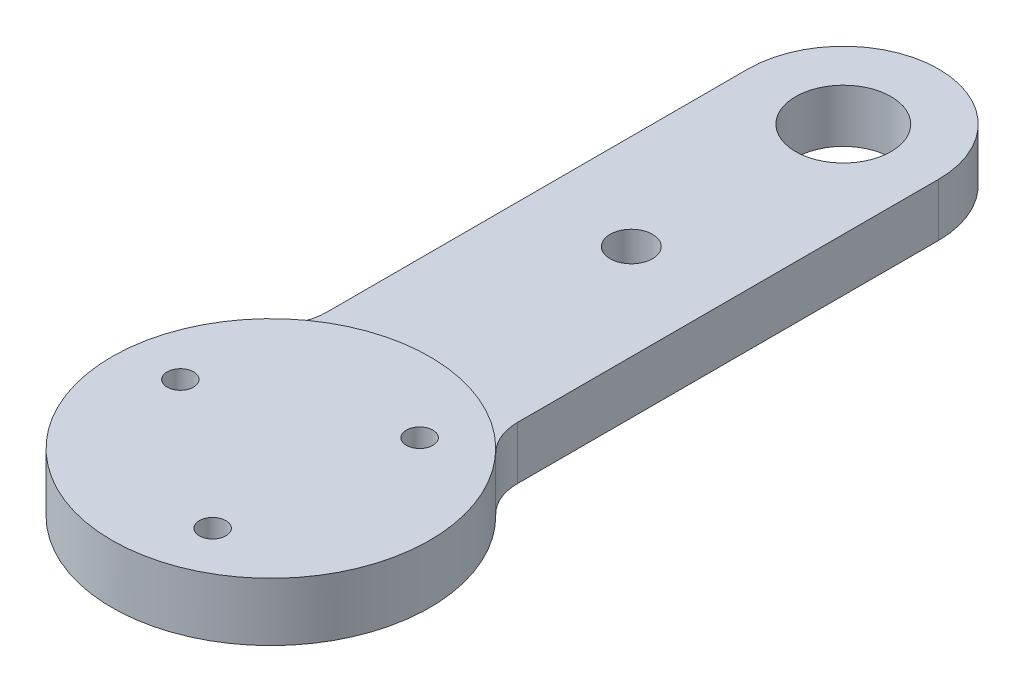
ISO-10303-21;
HEADER;
FILE_DESCRIPTION(('STEP AP214'),'2;1');
FILE_NAME('part.step','',(''),(''),'','','');
FILE_SCHEMA(('AUTOMOTIVE_DESIGN { 1 0 10303 214 1 1 1 1 }'));
ENDSEC;
DATA;
#1=APPLICATION_CONTEXT('core data for automotive mechanical design processes');
#2=APPLICATION_PROTOCOL_DEFINITION('international standard','automotive_design',2000,#1);
#3=PRODUCT_CONTEXT('',#1,'mechanical');
#4=PRODUCT('Part','Part','',(#3));
#5=PRODUCT_RELATED_PRODUCT_CATEGORY('part','',(#4));
#6=PRODUCT_DEFINITION_FORMATION('','',#4);
#7=PRODUCT_DEFINITION_CONTEXT('part definition',#1,'design');
#8=PRODUCT_DEFINITION('design','',#6,#7);
#9=PRODUCT_DEFINITION_SHAPE('','',#8);
#10=(LENGTH_UNIT() NAMED_UNIT(*) SI_UNIT(.MILLI.,.METRE.));
#11=(NAMED_UNIT(*) PLANE_ANGLE_UNIT() SI_UNIT($,.RADIAN.));
#12=(NAMED_UNIT(*) SI_UNIT($,.STERADIAN.) SOLID_ANGLE_UNIT());
#13=UNCERTAINTY_MEASURE_WITH_UNIT(LENGTH_MEASURE(1.E-05),#10,'distance_accuracy_value','');
#14=(GEOMETRIC_REPRESENTATION_CONTEXT(3) GLOBAL_UNCERTAINTY_ASSIGNED_CONTEXT((#13)) GLOBAL_UNIT_ASSIGNED_CONTEXT((#10,
#11,#12)) REPRESENTATION_CONTEXT('',''));
#15=CARTESIAN_POINT('',(0.,0.,0.));
#16=DIRECTION('',(0.,0.,1.));
#17=DIRECTION('',(1.,0.,0.));
#18=AXIS2_PLACEMENT_3D('',#15,#16,#17);
#19=CARTESIAN_POINT('',(-5.86046511627907,5.,-23.546511627907));
#20=DIRECTION('',(0.,-1.,0.));
#21=DIRECTION('',(0.,0.,-1.));
#22=AXIS2_PLACEMENT_3D('',#19,#20,#21);
#23=PLANE('',#22);
#24=CARTESIAN_POINT('',(-5.86046511627907,5.,-3.54651162790698));
#25=DIRECTION('',(0.,1.,0.));
#26=DIRECTION('',(0.,0.,1.));
#27=AXIS2_PLACEMENT_3D('',#24,#25,#26);
#28=CIRCLE('',#27,2.);
#29=CARTESIAN_POINT('',(-5.86046511627907,5.,-1.54651162790697));
#30=VERTEX_POINT('',#29);
#31=EDGE_CURVE('E127',#30,#30,#28,.T.);
#32=ORIENTED_EDGE('',*,*,#31,.F.);
#33=EDGE_LOOP('',(#32));
#34=FACE_BOUND('',#33,.T.);
#35=CARTESIAN_POINT('',(-5.86046511627907,5.,-23.546511627907));
#36=DIRECTION('',(0.,1.,0.));
#37=DIRECTION('',(0.,0.,1.));
#38=AXIS2_PLACEMENT_3D('',#35,#36,#37);
#39=CIRCLE('',#38,4.5);
#40=CARTESIAN_POINT('',(-5.86046511627907,5.,-19.046511627907));
#41=VERTEX_POINT('',#40);
#42=EDGE_CURVE('E136',#41,#41,#39,.T.);
#43=ORIENTED_EDGE('',*,*,#42,.F.);
#44=EDGE_LOOP('',(#43));
#45=FACE_BOUND('',#44,.T.);
#46=CARTESIAN_POINT('',(-5.86046511627907,5.,30.453488372093));
#47=DIRECTION('',(0.,1.,0.));
#48=DIRECTION('',(0.,0.,1.));
#49=AXIS2_PLACEMENT_3D('',#46,#47,#48);
#50=CIRCLE('',#49,15.);
#51=CARTESIAN_POINT('',(4.63953488372093,5.,19.7413457292787));
#52=VERTEX_POINT('',#51);
#53=CARTESIAN_POINT('',(-16.3604651162791,5.,19.7413457292787));
#54=VERTEX_POINT('',#53);
#55=EDGE_CURVE('E111',#52,#54,#50,.T.);
#56=ORIENTED_EDGE('',*,*,#55,.F.);
#57=CARTESIAN_POINT('',(8.13953488372107,5.,16.1706315150073));
#58=DIRECTION('',(0.,-1.,0.));
#59=DIRECTION('',(0.,0.,1.));
#60=AXIS2_PLACEMENT_3D('',#57,#58,#59);
#61=CIRCLE('',#60,5.00000000000013);
#62=CARTESIAN_POINT('',(3.13953488372094,5.,16.1706315150073));
#63=VERTEX_POINT('',#62);
#64=EDGE_CURVE('E93',#52,#63,#61,.T.);
#65=ORIENTED_EDGE('',*,*,#64,.T.);
#66=DIRECTION('',(0.,0.,-1.));
#67=VECTOR('',#66,1.);
#68=CARTESIAN_POINT('',(3.13953488372093,5.,-23.546511627907));
#69=LINE('',#68,#67);
#70=CARTESIAN_POINT('',(3.13953488372093,5.,-23.546511627907));
#71=VERTEX_POINT('',#70);
#72=EDGE_CURVE('E103',#63,#71,#69,.T.);
#73=ORIENTED_EDGE('',*,*,#72,.T.);
#74=CARTESIAN_POINT('',(-5.86046511627907,5.,-23.546511627907));
#75=DIRECTION('',(0.,1.,0.));
#76=DIRECTION('',(0.,0.,-1.));
#77=AXIS2_PLACEMENT_3D('',#74,#75,#76);
#78=CIRCLE('',#77,9.);
#79=CARTESIAN_POINT('',(-14.8604651162791,5.,-23.546511627907));
#80=VERTEX_POINT('',#79);
#81=EDGE_CURVE('E140',#71,#80,#78,.T.);
#82=ORIENTED_EDGE('',*,*,#81,.T.);
#83=DIRECTION('',(0.,0.,1.));
#84=VECTOR('',#83,1.);
#85=CARTESIAN_POINT('',(-14.8604651162791,5.,-23.546511627907));
#86=LINE('',#85,#84);
#87=CARTESIAN_POINT('',(-14.8604651162791,5.,16.1706315150073));
#88=VERTEX_POINT('',#87);
#89=EDGE_CURVE('E144',#80,#88,#86,.T.);
#90=ORIENTED_EDGE('',*,*,#89,.T.);
#91=CARTESIAN_POINT('',(-19.8604651162791,5.,16.1706315150073));
#92=DIRECTION('',(0.,-1.,0.));
#93=DIRECTION('',(0.,0.,1.));
#94=AXIS2_PLACEMENT_3D('',#91,#92,#93);
#95=CIRCLE('',#94,5.00000000000001);
#96=EDGE_CURVE('E104',#88,#54,#95,.T.);
#97=ORIENTED_EDGE('',*,*,#96,.T.);
#98=EDGE_LOOP('',(#56,#65,#73,#82,#90,#97));
#99=FACE_BOUND('',#98,.T.);
#100=ADVANCED_FACE('F39',(#34,#45,#99),#23,.F.);
#101=CARTESIAN_POINT('',(-5.86046511627907,0.,-23.546511627907));
#102=DIRECTION('',(0.,1.,0.));
#103=DIRECTION('',(0.,0.,1.));
#104=AXIS2_PLACEMENT_3D('',#101,#102,#103);
#105=PLANE('',#104);
#106=CARTESIAN_POINT('',(-5.86046511627907,0.,-23.546511627907));
#107=DIRECTION('',(0.,1.,0.));
#108=DIRECTION('',(0.,0.,1.));
#109=AXIS2_PLACEMENT_3D('',#106,#107,#108);
#110=CIRCLE('',#109,9.);
#111=CARTESIAN_POINT('',(3.13953488372093,0.,-23.546511627907));
#112=VERTEX_POINT('',#111);
#113=CARTESIAN_POINT('',(-14.8604651162791,0.,-23.546511627907));
#114=VERTEX_POINT('',#113);
#115=EDGE_CURVE('E179',#112,#114,#110,.T.);
#116=ORIENTED_EDGE('',*,*,#115,.F.);
#117=DIRECTION('',(0.,0.,-1.));
#118=VECTOR('',#117,1.);
#119=CARTESIAN_POINT('',(3.13953488372093,0.,-23.546511627907));
#120=LINE('',#119,#118);
#121=CARTESIAN_POINT('',(3.13953488372094,0.,16.1706315150073));
#122=VERTEX_POINT('',#121);
#123=EDGE_CURVE('E55',#122,#112,#120,.T.);
#124=ORIENTED_EDGE('',*,*,#123,.F.);
#125=CARTESIAN_POINT('',(8.13953488372094,0.,16.1706315150073));
#126=DIRECTION('',(0.,-1.,0.));
#127=DIRECTION('',(0.,0.,-1.));
#128=AXIS2_PLACEMENT_3D('',#125,#126,#127);
#129=CIRCLE('',#128,5.);
#130=CARTESIAN_POINT('',(4.63953488372093,0.,19.7413457292787));
#131=VERTEX_POINT('',#130);
#132=EDGE_CURVE('E191',#131,#122,#129,.T.);
#133=ORIENTED_EDGE('',*,*,#132,.F.);
#134=CARTESIAN_POINT('',(-5.86046511627907,0.,30.453488372093));
#135=DIRECTION('',(0.,1.,0.));
#136=DIRECTION('',(0.,0.,1.));
#137=AXIS2_PLACEMENT_3D('',#134,#135,#136);
#138=CIRCLE('',#137,15.);
#139=CARTESIAN_POINT('',(-16.3604651162791,0.,19.7413457292787));
#140=VERTEX_POINT('',#139);
#141=EDGE_CURVE('E113',#140,#131,#138,.T.);
#142=ORIENTED_EDGE('',*,*,#141,.F.);
#143=CARTESIAN_POINT('',(-19.8604651162791,0.,16.1706315150073));
#144=DIRECTION('',(0.,-1.,0.));
#145=DIRECTION('',(0.,0.,1.));
#146=AXIS2_PLACEMENT_3D('',#143,#144,#145);
#147=CIRCLE('',#146,5.);
#148=CARTESIAN_POINT('',(-14.8604651162791,0.,16.1706315150073));
#149=VERTEX_POINT('',#148);
#150=EDGE_CURVE('E186',#149,#140,#147,.T.);
#151=ORIENTED_EDGE('',*,*,#150,.F.);
#152=DIRECTION('',(0.,0.,1.));
#153=VECTOR('',#152,1.);
#154=CARTESIAN_POINT('',(-14.8604651162791,0.,-23.546511627907));
#155=LINE('',#154,#153);
#156=EDGE_CURVE('E183',#114,#149,#155,.T.);
#157=ORIENTED_EDGE('',*,*,#156,.F.);
#158=EDGE_LOOP('',(#116,#124,#133,#142,#151,#157));
#159=FACE_BOUND('',#158,.T.);
#160=CARTESIAN_POINT('',(-5.86046511627907,0.,-23.546511627907));
#161=DIRECTION('',(0.,1.,0.));
#162=DIRECTION('',(0.,0.,1.));
#163=AXIS2_PLACEMENT_3D('',#160,#161,#162);
#164=CIRCLE('',#163,4.5);
#165=CARTESIAN_POINT('',(-5.86046511627907,0.,-19.046511627907));
#166=VERTEX_POINT('',#165);
#167=EDGE_CURVE('E175',#166,#166,#164,.T.);
#168=ORIENTED_EDGE('',*,*,#167,.T.);
#169=EDGE_LOOP('',(#168));
#170=FACE_BOUND('',#169,.T.);
#171=CARTESIAN_POINT('',(-5.86046511627907,0.,-3.54651162790698));
#172=DIRECTION('',(0.,1.,0.));
#173=DIRECTION('',(0.,0.,1.));
#174=AXIS2_PLACEMENT_3D('',#171,#172,#173);
#175=CIRCLE('',#174,2.);
#176=CARTESIAN_POINT('',(-5.86046511627907,0.,-1.54651162790697));
#177=VERTEX_POINT('',#176);
#178=EDGE_CURVE('E171',#177,#177,#175,.T.);
#179=ORIENTED_EDGE('',*,*,#178,.T.);
#180=EDGE_LOOP('',(#179));
#181=FACE_BOUND('',#180,.T.);
#182=CARTESIAN_POINT('',(-5.86046511627907,0.,30.453488372093));
#183=DIRECTION('',(0.,1.,0.));
#184=DIRECTION('',(0.,0.,1.));
#185=AXIS2_PLACEMENT_3D('',#182,#183,#184);
#186=CIRCLE('',#185,4.5);
#187=CARTESIAN_POINT('',(-5.86046511627907,0.,34.953488372093));
#188=VERTEX_POINT('',#187);
#189=EDGE_CURVE('E164',#188,#188,#186,.T.);
#190=ORIENTED_EDGE('',*,*,#189,.T.);
#191=EDGE_LOOP('',(#190));
#192=FACE_BOUND('',#191,.T.);
#193=CARTESIAN_POINT('',(-15.7665168787197,0.,29.0859583066661));
#194=DIRECTION('',(0.,1.,0.));
#195=DIRECTION('',(0.,0.,1.));
#196=AXIS2_PLACEMENT_3D('',#193,#194,#195);
#197=CIRCLE('',#196,1.25);
#198=CARTESIAN_POINT('',(-15.7665168787197,0.,30.3359583066661));
#199=VERTEX_POINT('',#198);
#200=EDGE_CURVE('E160',#199,#199,#197,.T.);
#201=ORIENTED_EDGE('',*,*,#200,.T.);
#202=EDGE_LOOP('',(#201));
#203=FACE_BOUND('',#202,.T.);
#204=CARTESIAN_POINT('',(-2.09175501215743,0.,39.7161458822837));
#205=DIRECTION('',(0.,1.,0.));
#206=DIRECTION('',(0.,0.,1.));
#207=AXIS2_PLACEMENT_3D('',#204,#205,#206);
#208=CIRCLE('',#207,1.25);
#209=CARTESIAN_POINT('',(-2.09175501215743,0.,40.9661458822837));
#210=VERTEX_POINT('',#209);
#211=EDGE_CURVE('E156',#210,#210,#208,.T.);
#212=ORIENTED_EDGE('',*,*,#211,.T.);
#213=EDGE_LOOP('',(#212));
#214=FACE_BOUND('',#213,.T.);
#215=CARTESIAN_POINT('',(0.276876542039908,0.,22.5583609273292));
#216=DIRECTION('',(0.,1.,0.));
#217=DIRECTION('',(0.,0.,1.));
#218=AXIS2_PLACEMENT_3D('',#215,#216,#217);
#219=CIRCLE('',#218,1.25);
#220=CARTESIAN_POINT('',(0.276876542039908,0.,23.8083609273292));
#221=VERTEX_POINT('',#220);
#222=EDGE_CURVE('E152',#221,#221,#219,.T.);
#223=ORIENTED_EDGE('',*,*,#222,.T.);
#224=EDGE_LOOP('',(#223));
#225=FACE_BOUND('',#224,.T.);
#226=ADVANCED_FACE('F209',(#159,#170,#181,#192,#203,#214,#225),#105,.F.);
#227=CARTESIAN_POINT('',(-5.86046511627907,0.5,-23.546511627907));
#228=DIRECTION('',(0.,-1.,0.));
#229=DIRECTION('',(0.,0.,-1.));
#230=AXIS2_PLACEMENT_3D('',#227,#228,#229);
#231=CYLINDRICAL_SURFACE('',#230,9.);
#232=ORIENTED_EDGE('',*,*,#115,.T.);
#233=DIRECTION('',(0.,-1.,0.));
#234=VECTOR('',#233,1.);
#235=CARTESIAN_POINT('',(-14.8604651162791,0.5,-23.546511627907));
#236=LINE('',#235,#234);
#237=EDGE_CURVE('E11',#80,#114,#236,.T.);
#238=ORIENTED_EDGE('',*,*,#237,.F.);
#239=ORIENTED_EDGE('',*,*,#81,.F.);
#240=DIRECTION('',(0.,-1.,0.));
#241=VECTOR('',#240,1.);
#242=CARTESIAN_POINT('',(3.13953488372093,0.5,-23.546511627907));
#243=LINE('',#242,#241);
#244=EDGE_CURVE('E196',#71,#112,#243,.T.);
#245=ORIENTED_EDGE('',*,*,#244,.T.);
#246=EDGE_LOOP('',(#232,#238,#239,#245));
#247=FACE_BOUND('',#246,.T.);
#248=ADVANCED_FACE('F41',(#247),#231,.T.);
#249=CARTESIAN_POINT('',(-14.8604651162791,0.5,-23.546511627907));
#250=DIRECTION('',(1.,0.,0.));
#251=DIRECTION('',(0.,0.,-1.));
#252=AXIS2_PLACEMENT_3D('',#249,#250,#251);
#253=PLANE('',#252);
#254=ORIENTED_EDGE('',*,*,#156,.T.);
#255=DIRECTION('',(0.,-1.,0.));
#256=VECTOR('',#255,1.);
#257=CARTESIAN_POINT('',(-14.8604651162791,0.5,16.1706315150073));
#258=LINE('',#257,#256);
#259=EDGE_CURVE('E48',#88,#149,#258,.T.);
#260=ORIENTED_EDGE('',*,*,#259,.F.);
#261=ORIENTED_EDGE('',*,*,#89,.F.);
#262=ORIENTED_EDGE('',*,*,#237,.T.);
#263=EDGE_LOOP('',(#254,#260,#261,#262));
#264=FACE_BOUND('',#263,.T.);
#265=ADVANCED_FACE('F214',(#264),#253,.F.);
#266=CARTESIAN_POINT('',(-19.8604651162791,0.5,16.1706315150073));
#267=DIRECTION('',(0.,-1.,0.));
#268=DIRECTION('',(0.,0.,-1.));
#269=AXIS2_PLACEMENT_3D('',#266,#267,#268);
#270=CYLINDRICAL_SURFACE('',#269,5.);
#271=ORIENTED_EDGE('',*,*,#150,.T.);
#272=DIRECTION('',(0.,-1.,0.));
#273=VECTOR('',#272,1.);
#274=CARTESIAN_POINT('',(-16.3604651162791,0.5,19.7413457292787));
#275=LINE('',#274,#273);
#276=EDGE_CURVE('E115',#54,#140,#275,.T.);
#277=ORIENTED_EDGE('',*,*,#276,.F.);
#278=ORIENTED_EDGE('',*,*,#96,.F.);
#279=ORIENTED_EDGE('',*,*,#259,.T.);
#280=EDGE_LOOP('',(#271,#277,#278,#279));
#281=FACE_BOUND('',#280,.T.);
#282=ADVANCED_FACE('F206',(#281),#270,.F.);
#283=CARTESIAN_POINT('',(-5.86046511627907,0.5,30.453488372093));
#284=DIRECTION('',(0.,-1.,0.));
#285=DIRECTION('',(0.,0.,-1.));
#286=AXIS2_PLACEMENT_3D('',#283,#284,#285);
#287=CYLINDRICAL_SURFACE('',#286,15.);
#288=ORIENTED_EDGE('',*,*,#141,.T.);
#289=DIRECTION('',(0.,-1.,0.));
#290=VECTOR('',#289,1.);
#291=CARTESIAN_POINT('',(4.63953488372093,0.5,19.7413457292787));
#292=LINE('',#291,#290);
#293=EDGE_CURVE('E96',#52,#131,#292,.T.);
#294=ORIENTED_EDGE('',*,*,#293,.F.);
#295=ORIENTED_EDGE('',*,*,#55,.T.);
#296=ORIENTED_EDGE('',*,*,#276,.T.);
#297=EDGE_LOOP('',(#288,#294,#295,#296));
#298=FACE_BOUND('',#297,.T.);
#299=CARTESIAN_POINT('',(-5.86046511627907,5.5,30.453488372093));
#300=DIRECTION('',(0.,1.,0.));
#301=DIRECTION('',(0.,0.,1.));
#302=AXIS2_PLACEMENT_3D('',#299,#300,#301);
#303=CIRCLE('',#302,15.);
#304=CARTESIAN_POINT('',(-5.86046511627907,5.5,45.453488372093));
#305=VERTEX_POINT('',#304);
#306=EDGE_CURVE('E121',#305,#305,#303,.T.);
#307=ORIENTED_EDGE('',*,*,#306,.F.);
#308=EDGE_LOOP('',(#307));
#309=FACE_BOUND('',#308,.T.);
#310=ADVANCED_FACE('F108',(#298,#309),#287,.T.);
#311=CARTESIAN_POINT('',(8.13953488372094,0.5,16.1706315150073));
#312=DIRECTION('',(0.,-1.,0.));
#313=DIRECTION('',(0.,0.,-1.));
#314=AXIS2_PLACEMENT_3D('',#311,#312,#313);
#315=CYLINDRICAL_SURFACE('',#314,5.);
#316=ORIENTED_EDGE('',*,*,#132,.T.);
#317=DIRECTION('',(0.,-1.,0.));
#318=VECTOR('',#317,1.);
#319=CARTESIAN_POINT('',(3.13953488372094,0.5,16.1706315150073));
#320=LINE('',#319,#318);
#321=EDGE_CURVE('E97',#63,#122,#320,.T.);
#322=ORIENTED_EDGE('',*,*,#321,.F.);
#323=ORIENTED_EDGE('',*,*,#64,.F.);
#324=ORIENTED_EDGE('',*,*,#293,.T.);
#325=EDGE_LOOP('',(#316,#322,#323,#324));
#326=FACE_BOUND('',#325,.T.);
#327=ADVANCED_FACE('F95',(#326),#315,.F.);
#328=CARTESIAN_POINT('',(3.13953488372093,0.5,-23.546511627907));
#329=DIRECTION('',(-1.,0.,0.));
#330=DIRECTION('',(0.,0.,1.));
#331=AXIS2_PLACEMENT_3D('',#328,#329,#330);
#332=PLANE('',#331);
#333=ORIENTED_EDGE('',*,*,#123,.T.);
#334=ORIENTED_EDGE('',*,*,#244,.F.);
#335=ORIENTED_EDGE('',*,*,#72,.F.);
#336=ORIENTED_EDGE('',*,*,#321,.T.);
#337=EDGE_LOOP('',(#333,#334,#335,#336));
#338=FACE_BOUND('',#337,.T.);
#339=ADVANCED_FACE('F211',(#338),#332,.F.);
#340=CARTESIAN_POINT('',(-5.86046511627907,0.5,-23.546511627907));
#341=DIRECTION('',(0.,-1.,0.));
#342=DIRECTION('',(0.,0.,-1.));
#343=AXIS2_PLACEMENT_3D('',#340,#341,#342);
#344=CYLINDRICAL_SURFACE('',#343,4.5);
#345=ORIENTED_EDGE('',*,*,#167,.F.);
#346=EDGE_LOOP('',(#345));
#347=FACE_BOUND('',#346,.T.);
#348=ORIENTED_EDGE('',*,*,#42,.T.);
#349=EDGE_LOOP('',(#348));
#350=FACE_BOUND('',#349,.T.);
#351=ADVANCED_FACE('F256',(#347,#350),#344,.F.);
#352=CARTESIAN_POINT('',(-5.86046511627907,0.5,-3.54651162790698));
#353=DIRECTION('',(0.,-1.,0.));
#354=DIRECTION('',(0.,0.,-1.));
#355=AXIS2_PLACEMENT_3D('',#352,#353,#354);
#356=CYLINDRICAL_SURFACE('',#355,2.);
#357=ORIENTED_EDGE('',*,*,#178,.F.);
#358=EDGE_LOOP('',(#357));
#359=FACE_BOUND('',#358,.T.);
#360=ORIENTED_EDGE('',*,*,#31,.T.);
#361=EDGE_LOOP('',(#360));
#362=FACE_BOUND('',#361,.T.);
#363=ADVANCED_FACE('F252',(#359,#362),#356,.F.);
#364=CARTESIAN_POINT('',(-5.86046511627907,0.5,30.453488372093));
#365=DIRECTION('',(0.,-1.,0.));
#366=DIRECTION('',(0.,0.,-1.));
#367=AXIS2_PLACEMENT_3D('',#364,#365,#366);
#368=CYLINDRICAL_SURFACE('',#367,4.5);
#369=CARTESIAN_POINT('',(-5.86046511627907,0.5,30.453488372093));
#370=DIRECTION('',(0.,1.,0.));
#371=DIRECTION('',(0.,0.,1.));
#372=AXIS2_PLACEMENT_3D('',#369,#370,#371);
#373=CIRCLE('',#372,4.5);
#374=CARTESIAN_POINT('',(-5.86046511627907,0.5,34.953488372093));
#375=VERTEX_POINT('',#374);
#376=EDGE_CURVE('E151',#375,#375,#373,.T.);
#377=ORIENTED_EDGE('',*,*,#376,.T.);
#378=EDGE_LOOP('',(#377));
#379=FACE_BOUND('',#378,.T.);
#380=ORIENTED_EDGE('',*,*,#189,.F.);
#381=EDGE_LOOP('',(#380));
#382=FACE_BOUND('',#381,.T.);
#383=ADVANCED_FACE('F248',(#379,#382),#368,.F.);
#384=CARTESIAN_POINT('',(-15.7665168787197,0.5,29.0859583066661));
#385=DIRECTION('',(0.,-1.,0.));
#386=DIRECTION('',(0.,0.,-1.));
#387=AXIS2_PLACEMENT_3D('',#384,#385,#386);
#388=CYLINDRICAL_SURFACE('',#387,1.25);
#389=ORIENTED_EDGE('',*,*,#200,.F.);
#390=EDGE_LOOP('',(#389));
#391=FACE_BOUND('',#390,.T.);
#392=CARTESIAN_POINT('',(-15.7665168787197,5.5,29.0859583066661));
#393=DIRECTION('',(0.,1.,0.));
#394=DIRECTION('',(0.,0.,1.));
#395=AXIS2_PLACEMENT_3D('',#392,#393,#394);
#396=CIRCLE('',#395,1.25);
#397=CARTESIAN_POINT('',(-15.7665168787197,5.5,30.3359583066661));
#398=VERTEX_POINT('',#397);
#399=EDGE_CURVE('E122',#398,#398,#396,.T.);
#400=ORIENTED_EDGE('',*,*,#399,.T.);
#401=EDGE_LOOP('',(#400));
#402=FACE_BOUND('',#401,.T.);
#403=ADVANCED_FACE('F244',(#391,#402),#388,.F.);
#404=CARTESIAN_POINT('',(-2.09175501215743,0.5,39.7161458822837));
#405=DIRECTION('',(0.,-1.,0.));
#406=DIRECTION('',(0.,0.,-1.));
#407=AXIS2_PLACEMENT_3D('',#404,#405,#406);
#408=CYLINDRICAL_SURFACE('',#407,1.25);
#409=ORIENTED_EDGE('',*,*,#211,.F.);
#410=EDGE_LOOP('',(#409));
#411=FACE_BOUND('',#410,.T.);
#412=CARTESIAN_POINT('',(-2.09175501215743,5.5,39.7161458822837));
#413=DIRECTION('',(0.,1.,0.));
#414=DIRECTION('',(0.,0.,1.));
#415=AXIS2_PLACEMENT_3D('',#412,#413,#414);
#416=CIRCLE('',#415,1.25);
#417=CARTESIAN_POINT('',(-2.09175501215743,5.5,40.9661458822837));
#418=VERTEX_POINT('',#417);
#419=EDGE_CURVE('E420',#418,#418,#416,.T.);
#420=ORIENTED_EDGE('',*,*,#419,.T.);
#421=EDGE_LOOP('',(#420));
#422=FACE_BOUND('',#421,.T.);
#423=ADVANCED_FACE('F240',(#411,#422),#408,.F.);
#424=CARTESIAN_POINT('',(0.276876542039908,0.5,22.5583609273292));
#425=DIRECTION('',(0.,-1.,0.));
#426=DIRECTION('',(0.,0.,-1.));
#427=AXIS2_PLACEMENT_3D('',#424,#425,#426);
#428=CYLINDRICAL_SURFACE('',#427,1.25);
#429=ORIENTED_EDGE('',*,*,#222,.F.);
#430=EDGE_LOOP('',(#429));
#431=FACE_BOUND('',#430,.T.);
#432=CARTESIAN_POINT('',(0.276876542039908,5.5,22.5583609273292));
#433=DIRECTION('',(0.,1.,0.));
#434=DIRECTION('',(0.,0.,1.));
#435=AXIS2_PLACEMENT_3D('',#432,#433,#434);
#436=CIRCLE('',#435,1.25);
#437=CARTESIAN_POINT('',(0.276876542039908,5.5,23.8083609273292));
#438=VERTEX_POINT('',#437);
#439=EDGE_CURVE('E130',#438,#438,#436,.T.);
#440=ORIENTED_EDGE('',*,*,#439,.T.);
#441=EDGE_LOOP('',(#440));
#442=FACE_BOUND('',#441,.T.);
#443=ADVANCED_FACE('F236',(#431,#442),#428,.F.);
#444=CARTESIAN_POINT('',(-5.86046511627907,0.5,-23.546511627907));
#445=DIRECTION('',(0.,-1.,0.));
#446=DIRECTION('',(0.,0.,-1.));
#447=AXIS2_PLACEMENT_3D('',#444,#445,#446);
#448=PLANE('',#447);
#449=ORIENTED_EDGE('',*,*,#376,.F.);
#450=EDGE_LOOP('',(#449));
#451=FACE_BOUND('',#450,.T.);
#452=ADVANCED_FACE('F233',(#451),#448,.T.);
#453=CARTESIAN_POINT('',(-5.86046511627907,5.5,30.453488372093));
#454=DIRECTION('',(0.,1.,0.));
#455=DIRECTION('',(0.,0.,1.));
#456=AXIS2_PLACEMENT_3D('',#453,#454,#455);
#457=PLANE('',#456);
#458=ORIENTED_EDGE('',*,*,#439,.F.);
#459=EDGE_LOOP('',(#458));
#460=FACE_BOUND('',#459,.T.);
#461=ORIENTED_EDGE('',*,*,#306,.T.);
#462=EDGE_LOOP('',(#461));
#463=FACE_BOUND('',#462,.T.);
#464=ORIENTED_EDGE('',*,*,#399,.F.);
#465=EDGE_LOOP('',(#464));
#466=FACE_BOUND('',#465,.T.);
#467=ORIENTED_EDGE('',*,*,#419,.F.);
#468=EDGE_LOOP('',(#467));
#469=FACE_BOUND('',#468,.T.);
#470=ADVANCED_FACE('F232',(#460,#463,#466,#469),#457,.T.);
#471=CLOSED_SHELL('',(#100,#226,#248,#265,#282,#310,#327,#339,#351,#363,#383,#403,#423,#443,
#452,#470));
#472=MANIFOLD_SOLID_BREP('B2',#471);
#473=ADVANCED_BREP_SHAPE_REPRESENTATION('',(#18,#472),#14);
#474=SHAPE_DEFINITION_REPRESENTATION(#9,#473);
ENDSEC;
END-ISO-10303-21;
